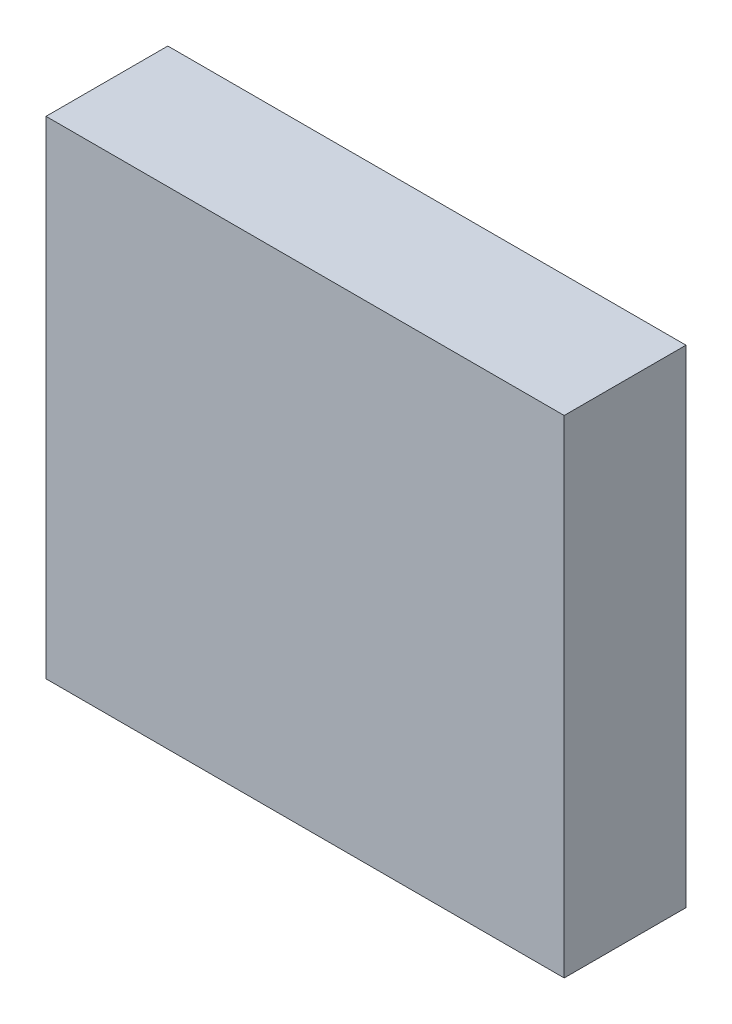
ISO-10303-21;
HEADER;
FILE_DESCRIPTION(('STEP AP214'),'2;1');
FILE_NAME('part.step','',(''),(''),'','','');
FILE_SCHEMA(('AUTOMOTIVE_DESIGN { 1 0 10303 214 1 1 1 1 }'));
ENDSEC;
DATA;
#1=APPLICATION_CONTEXT('core data for automotive mechanical design processes');
#2=APPLICATION_PROTOCOL_DEFINITION('international standard','automotive_design',2000,#1);
#3=PRODUCT_CONTEXT('',#1,'mechanical');
#4=PRODUCT('Part','Part','',(#3));
#5=PRODUCT_RELATED_PRODUCT_CATEGORY('part','',(#4));
#6=PRODUCT_DEFINITION_FORMATION('','',#4);
#7=PRODUCT_DEFINITION_CONTEXT('part definition',#1,'design');
#8=PRODUCT_DEFINITION('design','',#6,#7);
#9=PRODUCT_DEFINITION_SHAPE('','',#8);
#10=(LENGTH_UNIT() NAMED_UNIT(*) SI_UNIT(.MILLI.,.METRE.));
#11=(NAMED_UNIT(*) PLANE_ANGLE_UNIT() SI_UNIT($,.RADIAN.));
#12=(NAMED_UNIT(*) SI_UNIT($,.STERADIAN.) SOLID_ANGLE_UNIT());
#13=UNCERTAINTY_MEASURE_WITH_UNIT(LENGTH_MEASURE(1.E-05),#10,'distance_accuracy_value','');
#14=(GEOMETRIC_REPRESENTATION_CONTEXT(3) GLOBAL_UNCERTAINTY_ASSIGNED_CONTEXT((#13)) GLOBAL_UNIT_ASSIGNED_CONTEXT((#10,
#11,#12)) REPRESENTATION_CONTEXT('',''));
#15=CARTESIAN_POINT('',(0.,0.,0.));
#16=DIRECTION('',(0.,0.,1.));
#17=DIRECTION('',(1.,0.,0.));
#18=AXIS2_PLACEMENT_3D('',#15,#16,#17);
#19=CARTESIAN_POINT('',(53.1815925286087,-50.,25.));
#20=DIRECTION('',(-1.,0.,0.));
#21=DIRECTION('',(0.,0.,1.));
#22=AXIS2_PLACEMENT_3D('',#19,#20,#21);
#23=PLANE('',#22);
#24=DIRECTION('',(0.,1.,0.));
#25=VECTOR('',#24,1.);
#26=CARTESIAN_POINT('',(53.1815925286087,-50.,0.));
#27=LINE('',#26,#25);
#28=CARTESIAN_POINT('',(53.1815925286087,-50.,0.));
#29=VERTEX_POINT('',#28);
#30=CARTESIAN_POINT('',(53.1815925286087,50.,0.));
#31=VERTEX_POINT('',#30);
#32=EDGE_CURVE('E104',#29,#31,#27,.T.);
#33=ORIENTED_EDGE('',*,*,#32,.T.);
#34=DIRECTION('',(0.,0.,-1.));
#35=VECTOR('',#34,1.);
#36=CARTESIAN_POINT('',(53.1815925286087,50.,25.));
#37=LINE('',#36,#35);
#38=CARTESIAN_POINT('',(53.1815925286087,50.,25.));
#39=VERTEX_POINT('',#38);
#40=EDGE_CURVE('E11',#39,#31,#37,.T.);
#41=ORIENTED_EDGE('',*,*,#40,.F.);
#42=DIRECTION('',(0.,1.,0.));
#43=VECTOR('',#42,1.);
#44=CARTESIAN_POINT('',(53.1815925286087,-50.,25.));
#45=LINE('',#44,#43);
#46=CARTESIAN_POINT('',(53.1815925286087,-50.,25.));
#47=VERTEX_POINT('',#46);
#48=EDGE_CURVE('E92',#47,#39,#45,.T.);
#49=ORIENTED_EDGE('',*,*,#48,.F.);
#50=DIRECTION('',(0.,0.,-1.));
#51=VECTOR('',#50,1.);
#52=CARTESIAN_POINT('',(53.1815925286087,-50.,25.));
#53=LINE('',#52,#51);
#54=EDGE_CURVE('E100',#47,#29,#53,.T.);
#55=ORIENTED_EDGE('',*,*,#54,.T.);
#56=EDGE_LOOP('',(#33,#41,#49,#55));
#57=FACE_BOUND('',#56,.T.);
#58=ADVANCED_FACE('F41',(#57),#23,.F.);
#59=CARTESIAN_POINT('',(-53.1815925286087,50.,25.));
#60=DIRECTION('',(0.,-1.,0.));
#61=DIRECTION('',(0.,0.,-1.));
#62=AXIS2_PLACEMENT_3D('',#59,#60,#61);
#63=PLANE('',#62);
#64=DIRECTION('',(-1.,0.,0.));
#65=VECTOR('',#64,1.);
#66=CARTESIAN_POINT('',(-53.1815925286087,50.,0.));
#67=LINE('',#66,#65);
#68=CARTESIAN_POINT('',(-53.1815925286087,50.,0.));
#69=VERTEX_POINT('',#68);
#70=EDGE_CURVE('E96',#31,#69,#67,.T.);
#71=ORIENTED_EDGE('',*,*,#70,.T.);
#72=DIRECTION('',(0.,0.,-1.));
#73=VECTOR('',#72,1.);
#74=CARTESIAN_POINT('',(-53.1815925286087,50.,25.));
#75=LINE('',#74,#73);
#76=CARTESIAN_POINT('',(-53.1815925286087,50.,25.));
#77=VERTEX_POINT('',#76);
#78=EDGE_CURVE('E49',#77,#69,#75,.T.);
#79=ORIENTED_EDGE('',*,*,#78,.F.);
#80=DIRECTION('',(-1.,0.,0.));
#81=VECTOR('',#80,1.);
#82=CARTESIAN_POINT('',(-53.1815925286087,50.,25.));
#83=LINE('',#82,#81);
#84=EDGE_CURVE('E87',#39,#77,#83,.T.);
#85=ORIENTED_EDGE('',*,*,#84,.F.);
#86=ORIENTED_EDGE('',*,*,#40,.T.);
#87=EDGE_LOOP('',(#71,#79,#85,#86));
#88=FACE_BOUND('',#87,.T.);
#89=ADVANCED_FACE('F95',(#88),#63,.F.);
#90=CARTESIAN_POINT('',(-53.1815925286087,-50.,25.));
#91=DIRECTION('',(1.,0.,0.));
#92=DIRECTION('',(0.,0.,-1.));
#93=AXIS2_PLACEMENT_3D('',#90,#91,#92);
#94=PLANE('',#93);
#95=DIRECTION('',(0.,-1.,0.));
#96=VECTOR('',#95,1.);
#97=CARTESIAN_POINT('',(-53.1815925286087,-50.,0.));
#98=LINE('',#97,#96);
#99=CARTESIAN_POINT('',(-53.1815925286087,-50.,0.));
#100=VERTEX_POINT('',#99);
#101=EDGE_CURVE('E74',#69,#100,#98,.T.);
#102=ORIENTED_EDGE('',*,*,#101,.T.);
#103=DIRECTION('',(0.,0.,-1.));
#104=VECTOR('',#103,1.);
#105=CARTESIAN_POINT('',(-53.1815925286087,-50.,25.));
#106=LINE('',#105,#104);
#107=CARTESIAN_POINT('',(-53.1815925286087,-50.,25.));
#108=VERTEX_POINT('',#107);
#109=EDGE_CURVE('E97',#108,#100,#106,.T.);
#110=ORIENTED_EDGE('',*,*,#109,.F.);
#111=DIRECTION('',(0.,-1.,0.));
#112=VECTOR('',#111,1.);
#113=CARTESIAN_POINT('',(-53.1815925286087,-50.,25.));
#114=LINE('',#113,#112);
#115=EDGE_CURVE('E90',#77,#108,#114,.T.);
#116=ORIENTED_EDGE('',*,*,#115,.F.);
#117=ORIENTED_EDGE('',*,*,#78,.T.);
#118=EDGE_LOOP('',(#102,#110,#116,#117));
#119=FACE_BOUND('',#118,.T.);
#120=ADVANCED_FACE('F98',(#119),#94,.F.);
#121=CARTESIAN_POINT('',(-53.1815925286087,-50.,25.));
#122=DIRECTION('',(0.,1.,0.));
#123=DIRECTION('',(0.,0.,1.));
#124=AXIS2_PLACEMENT_3D('',#121,#122,#123);
#125=PLANE('',#124);
#126=DIRECTION('',(1.,0.,0.));
#127=VECTOR('',#126,1.);
#128=CARTESIAN_POINT('',(-53.1815925286087,-50.,0.));
#129=LINE('',#128,#127);
#130=EDGE_CURVE('E80',#100,#29,#129,.T.);
#131=ORIENTED_EDGE('',*,*,#130,.T.);
#132=ORIENTED_EDGE('',*,*,#54,.F.);
#133=DIRECTION('',(1.,0.,0.));
#134=VECTOR('',#133,1.);
#135=CARTESIAN_POINT('',(-53.1815925286087,-50.,25.));
#136=LINE('',#135,#134);
#137=EDGE_CURVE('E57',#108,#47,#136,.T.);
#138=ORIENTED_EDGE('',*,*,#137,.F.);
#139=ORIENTED_EDGE('',*,*,#109,.T.);
#140=EDGE_LOOP('',(#131,#132,#138,#139));
#141=FACE_BOUND('',#140,.T.);
#142=ADVANCED_FACE('F111',(#141),#125,.F.);
#143=CARTESIAN_POINT('',(0.,0.,25.));
#144=DIRECTION('',(0.,0.,-1.));
#145=DIRECTION('',(-1.,0.,0.));
#146=AXIS2_PLACEMENT_3D('',#143,#144,#145);
#147=PLANE('',#146);
#148=ORIENTED_EDGE('',*,*,#48,.T.);
#149=ORIENTED_EDGE('',*,*,#84,.T.);
#150=ORIENTED_EDGE('',*,*,#115,.T.);
#151=ORIENTED_EDGE('',*,*,#137,.T.);
#152=EDGE_LOOP('',(#148,#149,#150,#151));
#153=FACE_BOUND('',#152,.T.);
#154=ADVANCED_FACE('F88',(#153),#147,.F.);
#155=CARTESIAN_POINT('',(0.,0.,0.));
#156=DIRECTION('',(0.,0.,-1.));
#157=DIRECTION('',(-1.,0.,0.));
#158=AXIS2_PLACEMENT_3D('',#155,#156,#157);
#159=PLANE('',#158);
#160=ORIENTED_EDGE('',*,*,#32,.F.);
#161=ORIENTED_EDGE('',*,*,#130,.F.);
#162=ORIENTED_EDGE('',*,*,#101,.F.);
#163=ORIENTED_EDGE('',*,*,#70,.F.);
#164=EDGE_LOOP('',(#160,#161,#162,#163));
#165=FACE_BOUND('',#164,.T.);
#166=ADVANCED_FACE('F114',(#165),#159,.T.);
#167=CLOSED_SHELL('',(#58,#89,#120,#142,#154,#166));
#168=MANIFOLD_SOLID_BREP('B2',#167);
#169=ADVANCED_BREP_SHAPE_REPRESENTATION('',(#18,#168),#14);
#170=SHAPE_DEFINITION_REPRESENTATION(#9,#169);
ENDSEC;
END-ISO-10303-21;
